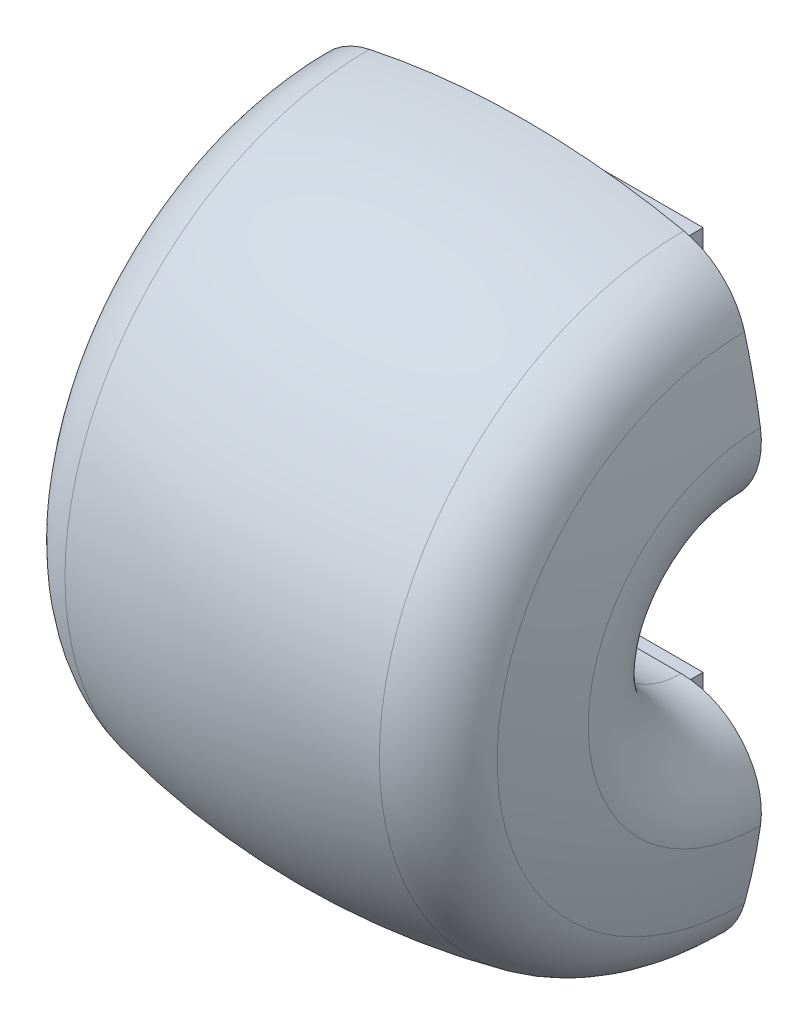
ISO-10303-21;
HEADER;
FILE_DESCRIPTION(('STEP AP214'),'2;1');
FILE_NAME('part.step','',(''),(''),'','','');
FILE_SCHEMA(('AUTOMOTIVE_DESIGN { 1 0 10303 214 1 1 1 1 }'));
ENDSEC;
DATA;
#1=APPLICATION_CONTEXT('core data for automotive mechanical design processes');
#2=APPLICATION_PROTOCOL_DEFINITION('international standard','automotive_design',2000,#1);
#3=PRODUCT_CONTEXT('',#1,'mechanical');
#4=PRODUCT('Part','Part','',(#3));
#5=PRODUCT_RELATED_PRODUCT_CATEGORY('part','',(#4));
#6=PRODUCT_DEFINITION_FORMATION('','',#4);
#7=PRODUCT_DEFINITION_CONTEXT('part definition',#1,'design');
#8=PRODUCT_DEFINITION('design','',#6,#7);
#9=PRODUCT_DEFINITION_SHAPE('','',#8);
#10=(LENGTH_UNIT() NAMED_UNIT(*) SI_UNIT(.MILLI.,.METRE.));
#11=(NAMED_UNIT(*) PLANE_ANGLE_UNIT() SI_UNIT($,.RADIAN.));
#12=(NAMED_UNIT(*) SI_UNIT($,.STERADIAN.) SOLID_ANGLE_UNIT());
#13=UNCERTAINTY_MEASURE_WITH_UNIT(LENGTH_MEASURE(1.E-05),#10,'distance_accuracy_value','');
#14=(GEOMETRIC_REPRESENTATION_CONTEXT(3) GLOBAL_UNCERTAINTY_ASSIGNED_CONTEXT((#13)) GLOBAL_UNIT_ASSIGNED_CONTEXT((#10,
#11,#12)) REPRESENTATION_CONTEXT('',''));
#15=CARTESIAN_POINT('',(0.,0.,0.));
#16=DIRECTION('',(0.,0.,1.));
#17=DIRECTION('',(1.,0.,0.));
#18=AXIS2_PLACEMENT_3D('',#15,#16,#17);
#19=CARTESIAN_POINT('',(23.971603069643,-4.99999999999999,0.));
#20=DIRECTION('',(0.,0.,1.));
#21=DIRECTION('',(-1.,0.,0.));
#22=AXIS2_PLACEMENT_3D('',#19,#20,#21);
#23=PLANE('',#22);
#24=DIRECTION('',(1.,0.,0.));
#25=VECTOR('',#24,1.);
#26=CARTESIAN_POINT('',(-15.,-5.,0.));
#27=LINE('',#26,#25);
#28=CARTESIAN_POINT('',(-9.63003104421189,-5.,0.));
#29=VERTEX_POINT('',#28);
#30=CARTESIAN_POINT('',(9.6300310442119,-4.99999999999999,0.));
#31=VERTEX_POINT('',#30);
#32=EDGE_CURVE('E224',#29,#31,#27,.T.);
#33=ORIENTED_EDGE('',*,*,#32,.T.);
#34=CARTESIAN_POINT('',(9.6300310442119,-9.99999999999999,0.));
#35=DIRECTION('',(0.,0.,1.));
#36=DIRECTION('',(0.,-1.,0.));
#37=AXIS2_PLACEMENT_3D('',#34,#35,#36);
#38=CIRCLE('',#37,5.);
#39=CARTESIAN_POINT('',(14.5755783657455,-10.7359087514578,0.));
#40=VERTEX_POINT('',#39);
#41=EDGE_CURVE('E47',#31,#40,#38,.F.);
#42=ORIENTED_EDGE('',*,*,#41,.T.);
#43=CARTESIAN_POINT('',(-23.971603069643,-5.,0.));
#44=DIRECTION('',(0.,0.,-1.));
#45=DIRECTION('',(1.,0.,0.));
#46=AXIS2_PLACEMENT_3D('',#43,#44,#45);
#47=CIRCLE('',#46,38.971603069643);
#48=CARTESIAN_POINT('',(13.5806306200409,-15.421880383749,-1.07690415139462E-13));
#49=VERTEX_POINT('',#48);
#50=EDGE_CURVE('E227',#40,#49,#47,.T.);
#51=ORIENTED_EDGE('',*,*,#50,.T.);
#52=CARTESIAN_POINT('',(8.7627336473943,-14.0847682863682,0.));
#53=DIRECTION('',(0.,0.,1.));
#54=DIRECTION('',(0.,-1.,0.));
#55=AXIS2_PLACEMENT_3D('',#52,#53,#54);
#56=CIRCLE('',#55,5.);
#57=CARTESIAN_POINT('',(9.7959217781913,-18.9768560090465,-1.32514677250998E-13));
#58=VERTEX_POINT('',#57);
#59=EDGE_CURVE('E247',#49,#58,#56,.F.);
#60=ORIENTED_EDGE('',*,*,#59,.T.);
#61=CARTESIAN_POINT('',(0.,27.4062829711118,1.91377051121383E-13));
#62=DIRECTION('',(0.,0.,-1.));
#63=DIRECTION('',(1.,0.,0.));
#64=AXIS2_PLACEMENT_3D('',#61,#62,#63);
#65=CIRCLE('',#64,47.4062829711118);
#66=CARTESIAN_POINT('',(-9.79592177819129,-18.9768560090465,-1.32514677250998E-13));
#67=VERTEX_POINT('',#66);
#68=EDGE_CURVE('E229',#58,#67,#65,.T.);
#69=ORIENTED_EDGE('',*,*,#68,.T.);
#70=CARTESIAN_POINT('',(-8.76273364739429,-14.0847682863682,0.));
#71=DIRECTION('',(0.,0.,1.));
#72=DIRECTION('',(0.,-1.,0.));
#73=AXIS2_PLACEMENT_3D('',#70,#71,#72);
#74=CIRCLE('',#73,5.);
#75=CARTESIAN_POINT('',(-13.5806306200409,-15.421880383749,-1.07690415139462E-13));
#76=VERTEX_POINT('',#75);
#77=EDGE_CURVE('E245',#67,#76,#74,.F.);
#78=ORIENTED_EDGE('',*,*,#77,.T.);
#79=CARTESIAN_POINT('',(23.971603069643,-4.99999999999999,0.));
#80=DIRECTION('',(0.,0.,-1.));
#81=DIRECTION('',(-1.,0.,0.));
#82=AXIS2_PLACEMENT_3D('',#79,#80,#81);
#83=CIRCLE('',#82,38.971603069643);
#84=CARTESIAN_POINT('',(-14.5755783657455,-10.7359087514578,0.));
#85=VERTEX_POINT('',#84);
#86=EDGE_CURVE('E221',#76,#85,#83,.T.);
#87=ORIENTED_EDGE('',*,*,#86,.T.);
#88=CARTESIAN_POINT('',(-9.63003104421189,-10.,0.));
#89=DIRECTION('',(0.,0.,1.));
#90=DIRECTION('',(0.,-1.,0.));
#91=AXIS2_PLACEMENT_3D('',#88,#89,#90);
#92=CIRCLE('',#91,5.);
#93=EDGE_CURVE('E264',#85,#29,#92,.F.);
#94=ORIENTED_EDGE('',*,*,#93,.T.);
#95=EDGE_LOOP('',(#33,#42,#51,#60,#69,#78,#87,#94));
#96=FACE_BOUND('',#95,.T.);
#97=DIRECTION('',(0.,1.,0.));
#98=VECTOR('',#97,1.);
#99=CARTESIAN_POINT('',(-5.,-10.25,0.));
#100=LINE('',#99,#98);
#101=CARTESIAN_POINT('',(-5.,-13.75,0.));
#102=VERTEX_POINT('',#101);
#103=CARTESIAN_POINT('',(-4.99999999999999,-10.25,0.));
#104=VERTEX_POINT('',#103);
#105=EDGE_CURVE('E147',#102,#104,#100,.T.);
#106=ORIENTED_EDGE('',*,*,#105,.F.);
#107=DIRECTION('',(-1.,0.,0.));
#108=VECTOR('',#107,1.);
#109=CARTESIAN_POINT('',(5.,-13.75,0.));
#110=LINE('',#109,#108);
#111=CARTESIAN_POINT('',(5.,-13.75,0.));
#112=VERTEX_POINT('',#111);
#113=EDGE_CURVE('E149',#112,#102,#110,.T.);
#114=ORIENTED_EDGE('',*,*,#113,.F.);
#115=DIRECTION('',(0.,-1.,0.));
#116=VECTOR('',#115,1.);
#117=CARTESIAN_POINT('',(5.,-10.25,0.));
#118=LINE('',#117,#116);
#119=CARTESIAN_POINT('',(5.,-10.25,0.));
#120=VERTEX_POINT('',#119);
#121=EDGE_CURVE('E59',#120,#112,#118,.T.);
#122=ORIENTED_EDGE('',*,*,#121,.F.);
#123=DIRECTION('',(1.,0.,0.));
#124=VECTOR('',#123,1.);
#125=CARTESIAN_POINT('',(5.,-10.25,0.));
#126=LINE('',#125,#124);
#127=EDGE_CURVE('E54',#104,#120,#126,.T.);
#128=ORIENTED_EDGE('',*,*,#127,.F.);
#129=EDGE_LOOP('',(#106,#114,#122,#128));
#130=FACE_BOUND('',#129,.T.);
#131=ADVANCED_FACE('F39',(#96,#130),#23,.F.);
#132=CARTESIAN_POINT('',(23.971603069643,5.,0.));
#133=DIRECTION('',(0.,0.,-1.));
#134=DIRECTION('',(-1.,0.,0.));
#135=AXIS2_PLACEMENT_3D('',#132,#133,#134);
#136=PLANE('',#135);
#137=CARTESIAN_POINT('',(-23.971603069643,4.99999999999999,0.));
#138=DIRECTION('',(0.,0.,1.));
#139=DIRECTION('',(1.,0.,0.));
#140=AXIS2_PLACEMENT_3D('',#137,#138,#139);
#141=CIRCLE('',#140,38.971603069643);
#142=CARTESIAN_POINT('',(14.5755783657455,10.7359087514578,0.));
#143=VERTEX_POINT('',#142);
#144=CARTESIAN_POINT('',(13.5806306200409,15.4218803837491,0.));
#145=VERTEX_POINT('',#144);
#146=EDGE_CURVE('E216',#143,#145,#141,.T.);
#147=ORIENTED_EDGE('',*,*,#146,.F.);
#148=CARTESIAN_POINT('',(9.6300310442119,10.,0.));
#149=DIRECTION('',(0.,0.,-1.));
#150=DIRECTION('',(-1.,0.,0.));
#151=AXIS2_PLACEMENT_3D('',#148,#149,#150);
#152=CIRCLE('',#151,5.);
#153=CARTESIAN_POINT('',(9.6300310442119,5.,0.));
#154=VERTEX_POINT('',#153);
#155=EDGE_CURVE('E257',#143,#154,#152,.T.);
#156=ORIENTED_EDGE('',*,*,#155,.T.);
#157=DIRECTION('',(1.,0.,0.));
#158=VECTOR('',#157,1.);
#159=CARTESIAN_POINT('',(-15.,5.,0.));
#160=LINE('',#159,#158);
#161=CARTESIAN_POINT('',(-9.63003104421189,5.,0.));
#162=VERTEX_POINT('',#161);
#163=EDGE_CURVE('E213',#162,#154,#160,.T.);
#164=ORIENTED_EDGE('',*,*,#163,.F.);
#165=CARTESIAN_POINT('',(-9.6300310442119,10.,0.));
#166=DIRECTION('',(0.,0.,-1.));
#167=DIRECTION('',(-1.,0.,0.));
#168=AXIS2_PLACEMENT_3D('',#165,#166,#167);
#169=CIRCLE('',#168,5.);
#170=CARTESIAN_POINT('',(-14.5755783657455,10.7359087514578,0.));
#171=VERTEX_POINT('',#170);
#172=EDGE_CURVE('E255',#162,#171,#169,.T.);
#173=ORIENTED_EDGE('',*,*,#172,.T.);
#174=CARTESIAN_POINT('',(23.971603069643,5.,0.));
#175=DIRECTION('',(0.,0.,1.));
#176=DIRECTION('',(-1.,0.,0.));
#177=AXIS2_PLACEMENT_3D('',#174,#175,#176);
#178=CIRCLE('',#177,38.971603069643);
#179=CARTESIAN_POINT('',(-13.5806306200409,15.4218803837491,0.));
#180=VERTEX_POINT('',#179);
#181=EDGE_CURVE('E210',#180,#171,#178,.T.);
#182=ORIENTED_EDGE('',*,*,#181,.F.);
#183=CARTESIAN_POINT('',(-8.7627336473943,14.0847682863682,0.));
#184=DIRECTION('',(0.,0.,-1.));
#185=DIRECTION('',(-1.,0.,0.));
#186=AXIS2_PLACEMENT_3D('',#183,#184,#185);
#187=CIRCLE('',#186,5.);
#188=CARTESIAN_POINT('',(-9.79592177819129,18.9768560090465,0.));
#189=VERTEX_POINT('',#188);
#190=EDGE_CURVE('E237',#180,#189,#187,.T.);
#191=ORIENTED_EDGE('',*,*,#190,.T.);
#192=CARTESIAN_POINT('',(0.,-27.4062829711118,0.));
#193=DIRECTION('',(0.,0.,1.));
#194=DIRECTION('',(1.,0.,0.));
#195=AXIS2_PLACEMENT_3D('',#192,#193,#194);
#196=CIRCLE('',#195,47.4062829711118);
#197=CARTESIAN_POINT('',(9.79592177819129,18.9768560090465,0.));
#198=VERTEX_POINT('',#197);
#199=EDGE_CURVE('E218',#198,#189,#196,.T.);
#200=ORIENTED_EDGE('',*,*,#199,.F.);
#201=CARTESIAN_POINT('',(8.7627336473943,14.0847682863682,0.));
#202=DIRECTION('',(0.,0.,-1.));
#203=DIRECTION('',(-1.,0.,0.));
#204=AXIS2_PLACEMENT_3D('',#201,#202,#203);
#205=CIRCLE('',#204,5.);
#206=EDGE_CURVE('E239',#198,#145,#205,.T.);
#207=ORIENTED_EDGE('',*,*,#206,.T.);
#208=EDGE_LOOP('',(#147,#156,#164,#173,#182,#191,#200,#207));
#209=FACE_BOUND('',#208,.T.);
#210=DIRECTION('',(1.,0.,0.));
#211=VECTOR('',#210,1.);
#212=CARTESIAN_POINT('',(5.,13.75,0.));
#213=LINE('',#212,#211);
#214=CARTESIAN_POINT('',(-5.,13.75,0.));
#215=VERTEX_POINT('',#214);
#216=CARTESIAN_POINT('',(5.,13.75,0.));
#217=VERTEX_POINT('',#216);
#218=EDGE_CURVE('E195',#215,#217,#213,.T.);
#219=ORIENTED_EDGE('',*,*,#218,.F.);
#220=DIRECTION('',(0.,1.,0.));
#221=VECTOR('',#220,1.);
#222=CARTESIAN_POINT('',(-5.,13.75,0.));
#223=LINE('',#222,#221);
#224=CARTESIAN_POINT('',(-5.,10.25,0.));
#225=VERTEX_POINT('',#224);
#226=EDGE_CURVE('E153',#225,#215,#223,.T.);
#227=ORIENTED_EDGE('',*,*,#226,.F.);
#228=DIRECTION('',(-1.,0.,0.));
#229=VECTOR('',#228,1.);
#230=CARTESIAN_POINT('',(5.,10.25,0.));
#231=LINE('',#230,#229);
#232=CARTESIAN_POINT('',(5.,10.25,0.));
#233=VERTEX_POINT('',#232);
#234=EDGE_CURVE('E186',#233,#225,#231,.T.);
#235=ORIENTED_EDGE('',*,*,#234,.F.);
#236=DIRECTION('',(0.,-1.,0.));
#237=VECTOR('',#236,1.);
#238=CARTESIAN_POINT('',(5.,13.75,0.));
#239=LINE('',#238,#237);
#240=EDGE_CURVE('E197',#217,#233,#239,.T.);
#241=ORIENTED_EDGE('',*,*,#240,.F.);
#242=EDGE_LOOP('',(#219,#227,#235,#241));
#243=FACE_BOUND('',#242,.T.);
#244=ADVANCED_FACE('F280',(#209,#243),#136,.T.);
#245=CARTESIAN_POINT('',(23.971603069643,0.,0.));
#246=DIRECTION('',(-1.,0.,0.));
#247=DIRECTION('',(0.,-1.,0.));
#248=AXIS2_PLACEMENT_3D('',#245,#246,#247);
#249=DEGENERATE_TOROIDAL_SURFACE('',#248,4.99999999999999,38.971603069643,.T.);
#250=ORIENTED_EDGE('',*,*,#181,.T.);
#251=CARTESIAN_POINT('',(-14.5755783657455,0.,0.));
#252=DIRECTION('',(1.,0.,0.));
#253=DIRECTION('',(0.,1.,0.));
#254=AXIS2_PLACEMENT_3D('',#251,#252,#253);
#255=CIRCLE('',#254,10.7359087514578);
#256=EDGE_CURVE('E11',#171,#85,#255,.T.);
#257=ORIENTED_EDGE('',*,*,#256,.T.);
#258=ORIENTED_EDGE('',*,*,#86,.F.);
#259=CARTESIAN_POINT('',(-13.580630620041,0.,0.));
#260=DIRECTION('',(1.,0.,0.));
#261=DIRECTION('',(0.,1.,0.));
#262=AXIS2_PLACEMENT_3D('',#259,#260,#261);
#263=CIRCLE('',#262,15.4218803837491);
#264=EDGE_CURVE('E249',#76,#180,#263,.F.);
#265=ORIENTED_EDGE('',*,*,#264,.T.);
#266=EDGE_LOOP('',(#250,#257,#258,#265));
#267=FACE_BOUND('',#266,.T.);
#268=ADVANCED_FACE('F290',(#267),#249,.T.);
#269=CARTESIAN_POINT('',(0.,0.,0.));
#270=DIRECTION('',(-1.,0.,0.));
#271=DIRECTION('',(0.,-1.,0.));
#272=AXIS2_PLACEMENT_3D('',#269,#270,#271);
#273=DEGENERATE_TOROIDAL_SURFACE('',#272,27.4062829711118,47.4062829711118,.F.);
#274=ORIENTED_EDGE('',*,*,#68,.F.);
#275=CARTESIAN_POINT('',(9.7959217781913,0.,0.));
#276=DIRECTION('',(-1.,0.,0.));
#277=DIRECTION('',(0.,-1.,0.));
#278=AXIS2_PLACEMENT_3D('',#275,#276,#277);
#279=CIRCLE('',#278,18.9768560090465);
#280=EDGE_CURVE('E234',#58,#198,#279,.T.);
#281=ORIENTED_EDGE('',*,*,#280,.T.);
#282=ORIENTED_EDGE('',*,*,#199,.T.);
#283=CARTESIAN_POINT('',(-9.79592177819129,0.,0.));
#284=DIRECTION('',(1.,0.,0.));
#285=DIRECTION('',(0.,1.,0.));
#286=AXIS2_PLACEMENT_3D('',#283,#284,#285);
#287=CIRCLE('',#286,18.9768560090465);
#288=EDGE_CURVE('E232',#189,#67,#287,.T.);
#289=ORIENTED_EDGE('',*,*,#288,.T.);
#290=EDGE_LOOP('',(#274,#281,#282,#289));
#291=FACE_BOUND('',#290,.T.);
#292=ADVANCED_FACE('F300',(#291),#273,.F.);
#293=CARTESIAN_POINT('',(-23.971603069643,0.,0.));
#294=DIRECTION('',(-1.,0.,0.));
#295=DIRECTION('',(0.,-1.,0.));
#296=AXIS2_PLACEMENT_3D('',#293,#294,#295);
#297=DEGENERATE_TOROIDAL_SURFACE('',#296,4.99999999999999,38.971603069643,.T.);
#298=ORIENTED_EDGE('',*,*,#50,.F.);
#299=CARTESIAN_POINT('',(14.5755783657455,0.,0.));
#300=DIRECTION('',(-1.,0.,0.));
#301=DIRECTION('',(0.,-1.,0.));
#302=AXIS2_PLACEMENT_3D('',#299,#300,#301);
#303=CIRCLE('',#302,10.7359087514578);
#304=EDGE_CURVE('E252',#40,#143,#303,.T.);
#305=ORIENTED_EDGE('',*,*,#304,.T.);
#306=ORIENTED_EDGE('',*,*,#146,.T.);
#307=CARTESIAN_POINT('',(13.580630620041,0.,0.));
#308=DIRECTION('',(-1.,0.,0.));
#309=DIRECTION('',(0.,-1.,0.));
#310=AXIS2_PLACEMENT_3D('',#307,#308,#309);
#311=CIRCLE('',#310,15.4218803837491);
#312=EDGE_CURVE('E242',#145,#49,#311,.F.);
#313=ORIENTED_EDGE('',*,*,#312,.T.);
#314=EDGE_LOOP('',(#298,#305,#306,#313));
#315=FACE_BOUND('',#314,.T.);
#316=ADVANCED_FACE('F273',(#315),#297,.T.);
#317=CARTESIAN_POINT('',(-17.5,0.,0.));
#318=DIRECTION('',(-1.,0.,0.));
#319=DIRECTION('',(0.,-1.,0.));
#320=AXIS2_PLACEMENT_3D('',#317,#318,#319);
#321=CYLINDRICAL_SURFACE('',#320,5.);
#322=ORIENTED_EDGE('',*,*,#163,.T.);
#323=CARTESIAN_POINT('',(9.6300310442119,0.,0.));
#324=DIRECTION('',(1.,0.,0.));
#325=DIRECTION('',(0.,1.,0.));
#326=AXIS2_PLACEMENT_3D('',#323,#324,#325);
#327=CIRCLE('',#326,5.);
#328=EDGE_CURVE('E262',#154,#31,#327,.T.);
#329=ORIENTED_EDGE('',*,*,#328,.T.);
#330=ORIENTED_EDGE('',*,*,#32,.F.);
#331=CARTESIAN_POINT('',(-9.63003104421189,0.,0.));
#332=DIRECTION('',(1.,0.,0.));
#333=DIRECTION('',(0.,1.,0.));
#334=AXIS2_PLACEMENT_3D('',#331,#332,#333);
#335=CIRCLE('',#334,5.);
#336=EDGE_CURVE('E259',#29,#162,#335,.F.);
#337=ORIENTED_EDGE('',*,*,#336,.T.);
#338=EDGE_LOOP('',(#322,#329,#330,#337));
#339=FACE_BOUND('',#338,.T.);
#340=ADVANCED_FACE('F283',(#339),#321,.F.);
#341=CARTESIAN_POINT('',(8.7627336473943,0.,0.));
#342=DIRECTION('',(1.,0.,0.));
#343=DIRECTION('',(0.,1.,0.));
#344=AXIS2_PLACEMENT_3D('',#341,#342,#343);
#345=TOROIDAL_SURFACE('',#344,14.0847682863682,5.);
#346=ORIENTED_EDGE('',*,*,#59,.F.);
#347=ORIENTED_EDGE('',*,*,#312,.F.);
#348=ORIENTED_EDGE('',*,*,#206,.F.);
#349=ORIENTED_EDGE('',*,*,#280,.F.);
#350=EDGE_LOOP('',(#346,#347,#348,#349));
#351=FACE_BOUND('',#350,.T.);
#352=ADVANCED_FACE('F303',(#351),#345,.T.);
#353=CARTESIAN_POINT('',(-8.76273364739429,0.,0.));
#354=DIRECTION('',(1.,0.,0.));
#355=DIRECTION('',(0.,1.,0.));
#356=AXIS2_PLACEMENT_3D('',#353,#354,#355);
#357=TOROIDAL_SURFACE('',#356,14.0847682863682,5.);
#358=ORIENTED_EDGE('',*,*,#77,.F.);
#359=ORIENTED_EDGE('',*,*,#288,.F.);
#360=ORIENTED_EDGE('',*,*,#190,.F.);
#361=ORIENTED_EDGE('',*,*,#264,.F.);
#362=EDGE_LOOP('',(#358,#359,#360,#361));
#363=FACE_BOUND('',#362,.T.);
#364=ADVANCED_FACE('F295',(#363),#357,.T.);
#365=CARTESIAN_POINT('',(9.6300310442119,0.,0.));
#366=DIRECTION('',(1.,0.,0.));
#367=DIRECTION('',(0.,1.,0.));
#368=AXIS2_PLACEMENT_3D('',#365,#366,#367);
#369=TOROIDAL_SURFACE('',#368,10.,5.);
#370=ORIENTED_EDGE('',*,*,#41,.F.);
#371=ORIENTED_EDGE('',*,*,#328,.F.);
#372=ORIENTED_EDGE('',*,*,#155,.F.);
#373=ORIENTED_EDGE('',*,*,#304,.F.);
#374=EDGE_LOOP('',(#370,#371,#372,#373));
#375=FACE_BOUND('',#374,.T.);
#376=ADVANCED_FACE('F277',(#375),#369,.T.);
#377=CARTESIAN_POINT('',(-9.6300310442119,0.,0.));
#378=DIRECTION('',(1.,0.,0.));
#379=DIRECTION('',(0.,1.,0.));
#380=AXIS2_PLACEMENT_3D('',#377,#378,#379);
#381=TOROIDAL_SURFACE('',#380,10.,5.);
#382=ORIENTED_EDGE('',*,*,#93,.F.);
#383=ORIENTED_EDGE('',*,*,#256,.F.);
#384=ORIENTED_EDGE('',*,*,#172,.F.);
#385=ORIENTED_EDGE('',*,*,#336,.F.);
#386=EDGE_LOOP('',(#382,#383,#384,#385));
#387=FACE_BOUND('',#386,.T.);
#388=ADVANCED_FACE('F41',(#387),#381,.T.);
#389=CARTESIAN_POINT('',(-5.,13.75,-6.));
#390=DIRECTION('',(1.,0.,0.));
#391=DIRECTION('',(0.,1.,0.));
#392=AXIS2_PLACEMENT_3D('',#389,#390,#391);
#393=PLANE('',#392);
#394=ORIENTED_EDGE('',*,*,#226,.T.);
#395=DIRECTION('',(0.,0.,1.));
#396=VECTOR('',#395,1.);
#397=CARTESIAN_POINT('',(-5.,13.75,-6.));
#398=LINE('',#397,#396);
#399=CARTESIAN_POINT('',(-5.,13.75,-6.));
#400=VERTEX_POINT('',#399);
#401=EDGE_CURVE('E208',#400,#215,#398,.T.);
#402=ORIENTED_EDGE('',*,*,#401,.F.);
#403=DIRECTION('',(0.,1.,0.));
#404=VECTOR('',#403,1.);
#405=CARTESIAN_POINT('',(-5.,13.75,-6.));
#406=LINE('',#405,#404);
#407=CARTESIAN_POINT('',(-5.,10.25,-6.));
#408=VERTEX_POINT('',#407);
#409=EDGE_CURVE('E182',#408,#400,#406,.T.);
#410=ORIENTED_EDGE('',*,*,#409,.F.);
#411=DIRECTION('',(0.,0.,1.));
#412=VECTOR('',#411,1.);
#413=CARTESIAN_POINT('',(-5.,10.25,-6.));
#414=LINE('',#413,#412);
#415=EDGE_CURVE('E192',#408,#225,#414,.T.);
#416=ORIENTED_EDGE('',*,*,#415,.T.);
#417=EDGE_LOOP('',(#394,#402,#410,#416));
#418=FACE_BOUND('',#417,.T.);
#419=ADVANCED_FACE('F356',(#418),#393,.F.);
#420=CARTESIAN_POINT('',(5.,13.75,-6.));
#421=DIRECTION('',(0.,-1.,0.));
#422=DIRECTION('',(0.,0.,-1.));
#423=AXIS2_PLACEMENT_3D('',#420,#421,#422);
#424=PLANE('',#423);
#425=ORIENTED_EDGE('',*,*,#218,.T.);
#426=DIRECTION('',(0.,0.,1.));
#427=VECTOR('',#426,1.);
#428=CARTESIAN_POINT('',(5.,13.75,-6.));
#429=LINE('',#428,#427);
#430=CARTESIAN_POINT('',(5.,13.75,-6.));
#431=VERTEX_POINT('',#430);
#432=EDGE_CURVE('E205',#431,#217,#429,.T.);
#433=ORIENTED_EDGE('',*,*,#432,.F.);
#434=DIRECTION('',(1.,0.,0.));
#435=VECTOR('',#434,1.);
#436=CARTESIAN_POINT('',(5.,13.75,-6.));
#437=LINE('',#436,#435);
#438=EDGE_CURVE('E185',#400,#431,#437,.T.);
#439=ORIENTED_EDGE('',*,*,#438,.F.);
#440=ORIENTED_EDGE('',*,*,#401,.T.);
#441=EDGE_LOOP('',(#425,#433,#439,#440));
#442=FACE_BOUND('',#441,.T.);
#443=ADVANCED_FACE('F377',(#442),#424,.F.);
#444=CARTESIAN_POINT('',(5.,13.75,-6.));
#445=DIRECTION('',(-1.,0.,0.));
#446=DIRECTION('',(0.,0.,1.));
#447=AXIS2_PLACEMENT_3D('',#444,#445,#446);
#448=PLANE('',#447);
#449=ORIENTED_EDGE('',*,*,#240,.T.);
#450=DIRECTION('',(0.,0.,1.));
#451=VECTOR('',#450,1.);
#452=CARTESIAN_POINT('',(5.,10.25,-6.));
#453=LINE('',#452,#451);
#454=CARTESIAN_POINT('',(5.,10.25,-6.));
#455=VERTEX_POINT('',#454);
#456=EDGE_CURVE('E203',#455,#233,#453,.T.);
#457=ORIENTED_EDGE('',*,*,#456,.F.);
#458=DIRECTION('',(0.,-1.,0.));
#459=VECTOR('',#458,1.);
#460=CARTESIAN_POINT('',(5.,13.75,-6.));
#461=LINE('',#460,#459);
#462=EDGE_CURVE('E188',#431,#455,#461,.T.);
#463=ORIENTED_EDGE('',*,*,#462,.F.);
#464=ORIENTED_EDGE('',*,*,#432,.T.);
#465=EDGE_LOOP('',(#449,#457,#463,#464));
#466=FACE_BOUND('',#465,.T.);
#467=ADVANCED_FACE('F386',(#466),#448,.F.);
#468=CARTESIAN_POINT('',(5.,10.25,-6.));
#469=DIRECTION('',(0.,1.,0.));
#470=DIRECTION('',(0.,0.,1.));
#471=AXIS2_PLACEMENT_3D('',#468,#469,#470);
#472=PLANE('',#471);
#473=ORIENTED_EDGE('',*,*,#234,.T.);
#474=ORIENTED_EDGE('',*,*,#415,.F.);
#475=DIRECTION('',(-1.,0.,0.));
#476=VECTOR('',#475,1.);
#477=CARTESIAN_POINT('',(5.,10.25,-6.));
#478=LINE('',#477,#476);
#479=EDGE_CURVE('E190',#455,#408,#478,.T.);
#480=ORIENTED_EDGE('',*,*,#479,.F.);
#481=ORIENTED_EDGE('',*,*,#456,.T.);
#482=EDGE_LOOP('',(#473,#474,#480,#481));
#483=FACE_BOUND('',#482,.T.);
#484=ADVANCED_FACE('F397',(#483),#472,.F.);
#485=CARTESIAN_POINT('',(0.,0.,-6.));
#486=DIRECTION('',(0.,0.,-1.));
#487=DIRECTION('',(-1.,0.,0.));
#488=AXIS2_PLACEMENT_3D('',#485,#486,#487);
#489=PLANE('',#488);
#490=ORIENTED_EDGE('',*,*,#409,.T.);
#491=ORIENTED_EDGE('',*,*,#438,.T.);
#492=ORIENTED_EDGE('',*,*,#462,.T.);
#493=ORIENTED_EDGE('',*,*,#479,.T.);
#494=EDGE_LOOP('',(#490,#491,#492,#493));
#495=FACE_BOUND('',#494,.T.);
#496=ADVANCED_FACE('F408',(#495),#489,.T.);
#497=CARTESIAN_POINT('',(-5.,-10.25,-6.));
#498=DIRECTION('',(1.,0.,0.));
#499=DIRECTION('',(0.,1.,0.));
#500=AXIS2_PLACEMENT_3D('',#497,#498,#499);
#501=PLANE('',#500);
#502=ORIENTED_EDGE('',*,*,#105,.T.);
#503=DIRECTION('',(0.,0.,1.));
#504=VECTOR('',#503,1.);
#505=CARTESIAN_POINT('',(-5.,-10.25,-6.));
#506=LINE('',#505,#504);
#507=CARTESIAN_POINT('',(-5.,-10.25,-6.));
#508=VERTEX_POINT('',#507);
#509=EDGE_CURVE('E486',#508,#104,#506,.T.);
#510=ORIENTED_EDGE('',*,*,#509,.F.);
#511=DIRECTION('',(0.,1.,0.));
#512=VECTOR('',#511,1.);
#513=CARTESIAN_POINT('',(-5.,-10.25,-6.));
#514=LINE('',#513,#512);
#515=CARTESIAN_POINT('',(-5.,-13.75,-6.));
#516=VERTEX_POINT('',#515);
#517=EDGE_CURVE('E164',#516,#508,#514,.T.);
#518=ORIENTED_EDGE('',*,*,#517,.F.);
#519=DIRECTION('',(0.,0.,1.));
#520=VECTOR('',#519,1.);
#521=CARTESIAN_POINT('',(-5.,-13.75,-6.));
#522=LINE('',#521,#520);
#523=EDGE_CURVE('E160',#516,#102,#522,.T.);
#524=ORIENTED_EDGE('',*,*,#523,.T.);
#525=EDGE_LOOP('',(#502,#510,#518,#524));
#526=FACE_BOUND('',#525,.T.);
#527=ADVANCED_FACE('F166',(#526),#501,.F.);
#528=CARTESIAN_POINT('',(5.,-10.25,-6.));
#529=DIRECTION('',(0.,-1.,0.));
#530=DIRECTION('',(0.,0.,-1.));
#531=AXIS2_PLACEMENT_3D('',#528,#529,#530);
#532=PLANE('',#531);
#533=ORIENTED_EDGE('',*,*,#127,.T.);
#534=DIRECTION('',(0.,0.,1.));
#535=VECTOR('',#534,1.);
#536=CARTESIAN_POINT('',(5.,-10.25,-6.));
#537=LINE('',#536,#535);
#538=CARTESIAN_POINT('',(5.,-10.25,-6.));
#539=VERTEX_POINT('',#538);
#540=EDGE_CURVE('E172',#539,#120,#537,.T.);
#541=ORIENTED_EDGE('',*,*,#540,.F.);
#542=DIRECTION('',(1.,0.,0.));
#543=VECTOR('',#542,1.);
#544=CARTESIAN_POINT('',(5.,-10.25,-6.));
#545=LINE('',#544,#543);
#546=EDGE_CURVE('E179',#508,#539,#545,.T.);
#547=ORIENTED_EDGE('',*,*,#546,.F.);
#548=ORIENTED_EDGE('',*,*,#509,.T.);
#549=EDGE_LOOP('',(#533,#541,#547,#548));
#550=FACE_BOUND('',#549,.T.);
#551=ADVANCED_FACE('F429',(#550),#532,.F.);
#552=CARTESIAN_POINT('',(5.,-10.25,-6.));
#553=DIRECTION('',(-1.,0.,0.));
#554=DIRECTION('',(0.,-1.,0.));
#555=AXIS2_PLACEMENT_3D('',#552,#553,#554);
#556=PLANE('',#555);
#557=ORIENTED_EDGE('',*,*,#121,.T.);
#558=DIRECTION('',(0.,0.,1.));
#559=VECTOR('',#558,1.);
#560=CARTESIAN_POINT('',(5.,-13.75,-6.));
#561=LINE('',#560,#559);
#562=CARTESIAN_POINT('',(5.,-13.75,-6.));
#563=VERTEX_POINT('',#562);
#564=EDGE_CURVE('E163',#563,#112,#561,.T.);
#565=ORIENTED_EDGE('',*,*,#564,.F.);
#566=DIRECTION('',(0.,-1.,0.));
#567=VECTOR('',#566,1.);
#568=CARTESIAN_POINT('',(5.,-10.25,-6.));
#569=LINE('',#568,#567);
#570=EDGE_CURVE('E170',#539,#563,#569,.T.);
#571=ORIENTED_EDGE('',*,*,#570,.F.);
#572=ORIENTED_EDGE('',*,*,#540,.T.);
#573=EDGE_LOOP('',(#557,#565,#571,#572));
#574=FACE_BOUND('',#573,.T.);
#575=ADVANCED_FACE('F439',(#574),#556,.F.);
#576=CARTESIAN_POINT('',(5.,-13.75,-6.));
#577=DIRECTION('',(0.,1.,0.));
#578=DIRECTION('',(0.,0.,1.));
#579=AXIS2_PLACEMENT_3D('',#576,#577,#578);
#580=PLANE('',#579);
#581=ORIENTED_EDGE('',*,*,#113,.T.);
#582=ORIENTED_EDGE('',*,*,#523,.F.);
#583=DIRECTION('',(-1.,0.,0.));
#584=VECTOR('',#583,1.);
#585=CARTESIAN_POINT('',(5.,-13.75,-6.));
#586=LINE('',#585,#584);
#587=EDGE_CURVE('E168',#563,#516,#586,.T.);
#588=ORIENTED_EDGE('',*,*,#587,.F.);
#589=ORIENTED_EDGE('',*,*,#564,.T.);
#590=EDGE_LOOP('',(#581,#582,#588,#589));
#591=FACE_BOUND('',#590,.T.);
#592=ADVANCED_FACE('F158',(#591),#580,.F.);
#593=CARTESIAN_POINT('',(0.,0.,-6.));
#594=DIRECTION('',(0.,0.,-1.));
#595=DIRECTION('',(-1.,0.,0.));
#596=AXIS2_PLACEMENT_3D('',#593,#594,#595);
#597=PLANE('',#596);
#598=ORIENTED_EDGE('',*,*,#517,.T.);
#599=ORIENTED_EDGE('',*,*,#546,.T.);
#600=ORIENTED_EDGE('',*,*,#570,.T.);
#601=ORIENTED_EDGE('',*,*,#587,.T.);
#602=EDGE_LOOP('',(#598,#599,#600,#601));
#603=FACE_BOUND('',#602,.T.);
#604=ADVANCED_FACE('F460',(#603),#597,.T.);
#605=CLOSED_SHELL('',(#131,#244,#268,#292,#316,#340,#352,#364,#376,#388,#419,#443,#467,#484,
#496,#527,#551,#575,#592,#604));
#606=MANIFOLD_SOLID_BREP('B2',#605);
#607=ADVANCED_BREP_SHAPE_REPRESENTATION('',(#18,#606),#14);
#608=SHAPE_DEFINITION_REPRESENTATION(#9,#607);
ENDSEC;
END-ISO-10303-21;
